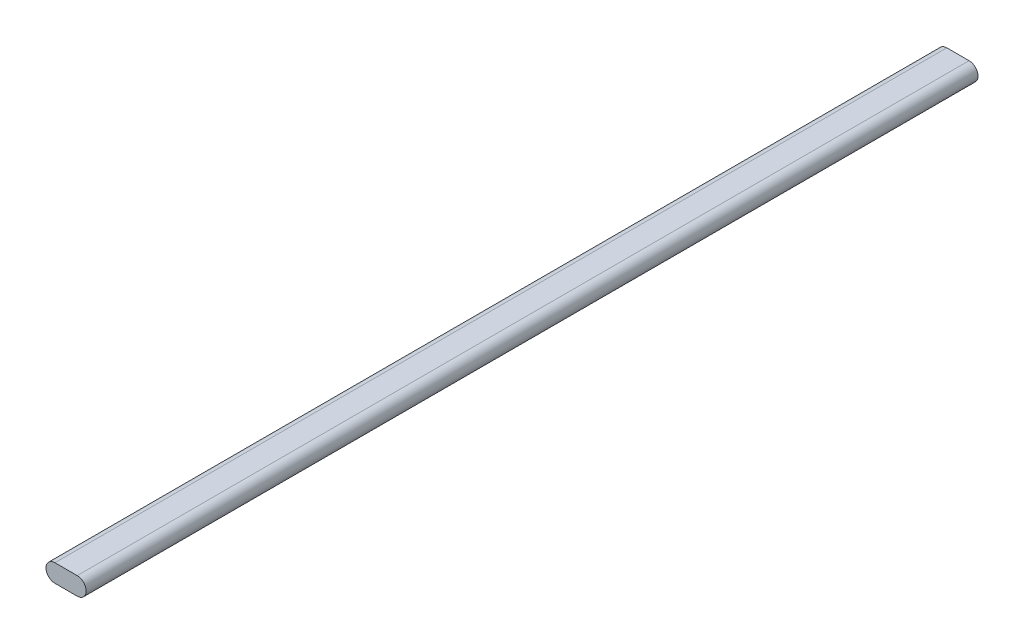
ISO-10303-21;
HEADER;
FILE_DESCRIPTION(('STEP AP214'),'2;1');
FILE_NAME('part.step','',(''),(''),'','','');
FILE_SCHEMA(('AUTOMOTIVE_DESIGN { 1 0 10303 214 1 1 1 1 }'));
ENDSEC;
DATA;
#1=APPLICATION_CONTEXT('core data for automotive mechanical design processes');
#2=APPLICATION_PROTOCOL_DEFINITION('international standard','automotive_design',2000,#1);
#3=PRODUCT_CONTEXT('',#1,'mechanical');
#4=PRODUCT('Part','Part','',(#3));
#5=PRODUCT_RELATED_PRODUCT_CATEGORY('part','',(#4));
#6=PRODUCT_DEFINITION_FORMATION('','',#4);
#7=PRODUCT_DEFINITION_CONTEXT('part definition',#1,'design');
#8=PRODUCT_DEFINITION('design','',#6,#7);
#9=PRODUCT_DEFINITION_SHAPE('','',#8);
#10=(LENGTH_UNIT() NAMED_UNIT(*) SI_UNIT(.MILLI.,.METRE.));
#11=(NAMED_UNIT(*) PLANE_ANGLE_UNIT() SI_UNIT($,.RADIAN.));
#12=(NAMED_UNIT(*) SI_UNIT($,.STERADIAN.) SOLID_ANGLE_UNIT());
#13=UNCERTAINTY_MEASURE_WITH_UNIT(LENGTH_MEASURE(1.E-05),#10,'distance_accuracy_value','');
#14=(GEOMETRIC_REPRESENTATION_CONTEXT(3) GLOBAL_UNCERTAINTY_ASSIGNED_CONTEXT((#13)) GLOBAL_UNIT_ASSIGNED_CONTEXT((#10,
#11,#12)) REPRESENTATION_CONTEXT('',''));
#15=CARTESIAN_POINT('',(0.,0.,0.));
#16=DIRECTION('',(0.,0.,1.));
#17=DIRECTION('',(1.,0.,0.));
#18=AXIS2_PLACEMENT_3D('',#15,#16,#17);
#19=CARTESIAN_POINT('',(0.,0.,10.));
#20=DIRECTION('',(0.,0.,-1.));
#21=DIRECTION('',(-1.,0.,0.));
#22=AXIS2_PLACEMENT_3D('',#19,#20,#21);
#23=CYLINDRICAL_SURFACE('',#22,0.1);
#24=CARTESIAN_POINT('',(0.,0.,0.));
#25=DIRECTION('',(0.,0.,1.));
#26=DIRECTION('',(1.,0.,0.));
#27=AXIS2_PLACEMENT_3D('',#24,#25,#26);
#28=CIRCLE('',#27,0.1);
#29=CARTESIAN_POINT('',(0.,0.1,0.));
#30=VERTEX_POINT('',#29);
#31=CARTESIAN_POINT('',(0.,-0.1,0.));
#32=VERTEX_POINT('',#31);
#33=EDGE_CURVE('E111',#30,#32,#28,.T.);
#34=ORIENTED_EDGE('',*,*,#33,.T.);
#35=DIRECTION('',(0.,0.,-1.));
#36=VECTOR('',#35,1.);
#37=CARTESIAN_POINT('',(0.,-0.1,10.));
#38=LINE('',#37,#36);
#39=CARTESIAN_POINT('',(0.,-0.1,10.));
#40=VERTEX_POINT('',#39);
#41=EDGE_CURVE('E11',#40,#32,#38,.T.);
#42=ORIENTED_EDGE('',*,*,#41,.F.);
#43=CARTESIAN_POINT('',(0.,0.,10.));
#44=DIRECTION('',(0.,0.,1.));
#45=DIRECTION('',(1.,0.,0.));
#46=AXIS2_PLACEMENT_3D('',#43,#44,#45);
#47=CIRCLE('',#46,0.1);
#48=CARTESIAN_POINT('',(0.,0.1,10.));
#49=VERTEX_POINT('',#48);
#50=EDGE_CURVE('E93',#49,#40,#47,.T.);
#51=ORIENTED_EDGE('',*,*,#50,.F.);
#52=DIRECTION('',(0.,0.,-1.));
#53=VECTOR('',#52,1.);
#54=CARTESIAN_POINT('',(0.,0.1,10.));
#55=LINE('',#54,#53);
#56=EDGE_CURVE('E60',#49,#30,#55,.T.);
#57=ORIENTED_EDGE('',*,*,#56,.T.);
#58=EDGE_LOOP('',(#34,#42,#51,#57));
#59=FACE_BOUND('',#58,.T.);
#60=ADVANCED_FACE('F43',(#59),#23,.T.);
#61=CARTESIAN_POINT('',(0.,-0.1,10.));
#62=DIRECTION('',(0.,1.,0.));
#63=DIRECTION('',(0.,0.,1.));
#64=AXIS2_PLACEMENT_3D('',#61,#62,#63);
#65=PLANE('',#64);
#66=DIRECTION('',(1.,0.,0.));
#67=VECTOR('',#66,1.);
#68=CARTESIAN_POINT('',(0.,-0.1,0.));
#69=LINE('',#68,#67);
#70=CARTESIAN_POINT('',(0.25,-0.1,0.));
#71=VERTEX_POINT('',#70);
#72=EDGE_CURVE('E99',#32,#71,#69,.T.);
#73=ORIENTED_EDGE('',*,*,#72,.T.);
#74=DIRECTION('',(0.,0.,-1.));
#75=VECTOR('',#74,1.);
#76=CARTESIAN_POINT('',(0.25,-0.1,10.));
#77=LINE('',#76,#75);
#78=CARTESIAN_POINT('',(0.25,-0.1,10.));
#79=VERTEX_POINT('',#78);
#80=EDGE_CURVE('E52',#79,#71,#77,.T.);
#81=ORIENTED_EDGE('',*,*,#80,.F.);
#82=DIRECTION('',(1.,0.,0.));
#83=VECTOR('',#82,1.);
#84=CARTESIAN_POINT('',(0.,-0.1,10.));
#85=LINE('',#84,#83);
#86=EDGE_CURVE('E86',#40,#79,#85,.T.);
#87=ORIENTED_EDGE('',*,*,#86,.F.);
#88=ORIENTED_EDGE('',*,*,#41,.T.);
#89=EDGE_LOOP('',(#73,#81,#87,#88));
#90=FACE_BOUND('',#89,.T.);
#91=ADVANCED_FACE('F98',(#90),#65,.F.);
#92=CARTESIAN_POINT('',(0.25,0.,10.));
#93=DIRECTION('',(0.,0.,-1.));
#94=DIRECTION('',(-1.,0.,0.));
#95=AXIS2_PLACEMENT_3D('',#92,#93,#94);
#96=CYLINDRICAL_SURFACE('',#95,0.1);
#97=CARTESIAN_POINT('',(0.25,0.,0.));
#98=DIRECTION('',(0.,0.,1.));
#99=DIRECTION('',(1.,0.,0.));
#100=AXIS2_PLACEMENT_3D('',#97,#98,#99);
#101=CIRCLE('',#100,0.1);
#102=CARTESIAN_POINT('',(0.25,0.1,0.));
#103=VERTEX_POINT('',#102);
#104=EDGE_CURVE('E116',#71,#103,#101,.T.);
#105=ORIENTED_EDGE('',*,*,#104,.T.);
#106=DIRECTION('',(0.,0.,-1.));
#107=VECTOR('',#106,1.);
#108=CARTESIAN_POINT('',(0.25,0.1,10.));
#109=LINE('',#108,#107);
#110=CARTESIAN_POINT('',(0.25,0.1,10.));
#111=VERTEX_POINT('',#110);
#112=EDGE_CURVE('E75',#111,#103,#109,.T.);
#113=ORIENTED_EDGE('',*,*,#112,.F.);
#114=CARTESIAN_POINT('',(0.25,0.,10.));
#115=DIRECTION('',(0.,0.,1.));
#116=DIRECTION('',(1.,0.,0.));
#117=AXIS2_PLACEMENT_3D('',#114,#115,#116);
#118=CIRCLE('',#117,0.1);
#119=EDGE_CURVE('E92',#79,#111,#118,.T.);
#120=ORIENTED_EDGE('',*,*,#119,.F.);
#121=ORIENTED_EDGE('',*,*,#80,.T.);
#122=EDGE_LOOP('',(#105,#113,#120,#121));
#123=FACE_BOUND('',#122,.T.);
#124=ADVANCED_FACE('F103',(#123),#96,.T.);
#125=CARTESIAN_POINT('',(0.,0.1,10.));
#126=DIRECTION('',(0.,1.,0.));
#127=DIRECTION('',(0.,0.,1.));
#128=AXIS2_PLACEMENT_3D('',#125,#126,#127);
#129=PLANE('',#128);
#130=DIRECTION('',(1.,0.,0.));
#131=VECTOR('',#130,1.);
#132=CARTESIAN_POINT('',(0.,0.1,0.));
#133=LINE('',#132,#131);
#134=EDGE_CURVE('E119',#30,#103,#133,.T.);
#135=ORIENTED_EDGE('',*,*,#134,.F.);
#136=ORIENTED_EDGE('',*,*,#56,.F.);
#137=DIRECTION('',(1.,0.,0.));
#138=VECTOR('',#137,1.);
#139=CARTESIAN_POINT('',(0.,0.1,10.));
#140=LINE('',#139,#138);
#141=EDGE_CURVE('E105',#49,#111,#140,.T.);
#142=ORIENTED_EDGE('',*,*,#141,.T.);
#143=ORIENTED_EDGE('',*,*,#112,.T.);
#144=EDGE_LOOP('',(#135,#136,#142,#143));
#145=FACE_BOUND('',#144,.T.);
#146=ADVANCED_FACE('F129',(#145),#129,.T.);
#147=CARTESIAN_POINT('',(0.,0.,10.));
#148=DIRECTION('',(0.,0.,1.));
#149=DIRECTION('',(1.,0.,0.));
#150=AXIS2_PLACEMENT_3D('',#147,#148,#149);
#151=PLANE('',#150);
#152=ORIENTED_EDGE('',*,*,#50,.T.);
#153=ORIENTED_EDGE('',*,*,#86,.T.);
#154=ORIENTED_EDGE('',*,*,#119,.T.);
#155=ORIENTED_EDGE('',*,*,#141,.F.);
#156=EDGE_LOOP('',(#152,#153,#154,#155));
#157=FACE_BOUND('',#156,.T.);
#158=ADVANCED_FACE('F89',(#157),#151,.T.);
#159=CARTESIAN_POINT('',(0.,0.,0.));
#160=DIRECTION('',(0.,0.,1.));
#161=DIRECTION('',(1.,0.,0.));
#162=AXIS2_PLACEMENT_3D('',#159,#160,#161);
#163=PLANE('',#162);
#164=ORIENTED_EDGE('',*,*,#33,.F.);
#165=ORIENTED_EDGE('',*,*,#134,.T.);
#166=ORIENTED_EDGE('',*,*,#104,.F.);
#167=ORIENTED_EDGE('',*,*,#72,.F.);
#168=EDGE_LOOP('',(#164,#165,#166,#167));
#169=FACE_BOUND('',#168,.T.);
#170=ADVANCED_FACE('F128',(#169),#163,.F.);
#171=CLOSED_SHELL('',(#60,#91,#124,#146,#158,#170));
#172=MANIFOLD_SOLID_BREP('B2',#171);
#173=ADVANCED_BREP_SHAPE_REPRESENTATION('',(#18,#172),#14);
#174=SHAPE_DEFINITION_REPRESENTATION(#9,#173);
ENDSEC;
END-ISO-10303-21;
